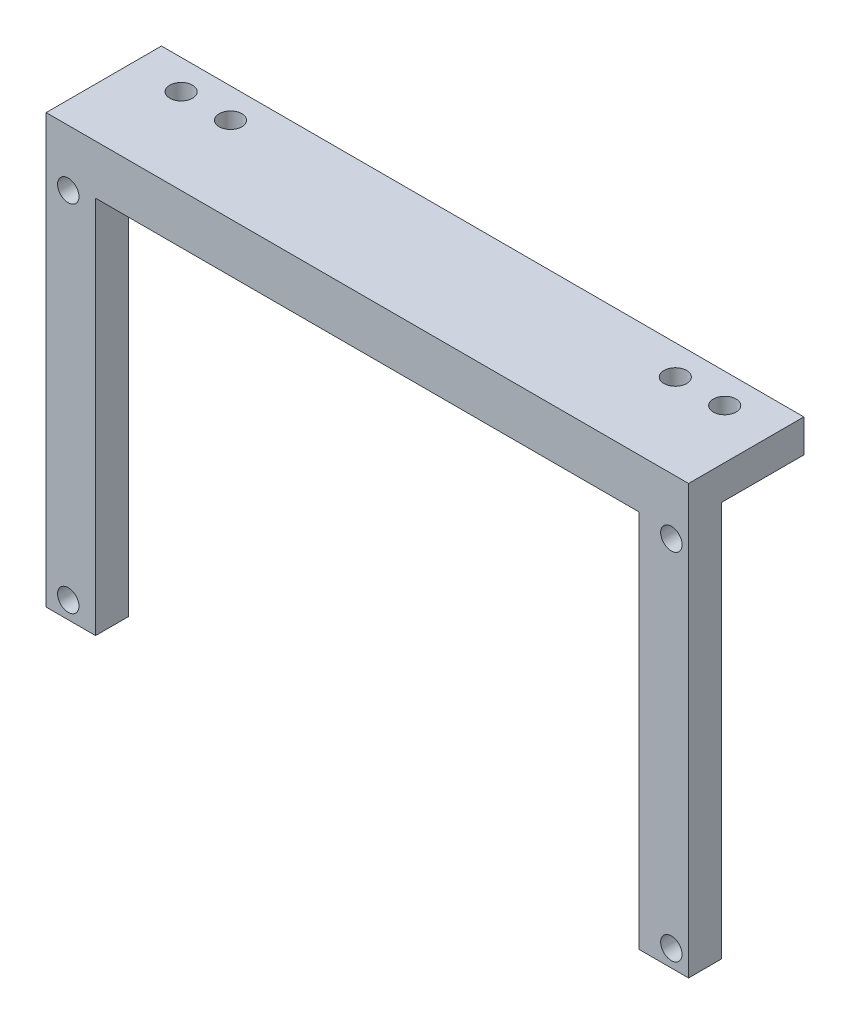
ISO-10303-21;
HEADER;
FILE_DESCRIPTION(('STEP AP214'),'2;1');
FILE_NAME('part.step','',(''),(''),'','','');
FILE_SCHEMA(('AUTOMOTIVE_DESIGN { 1 0 10303 214 1 1 1 1 }'));
ENDSEC;
DATA;
#1=APPLICATION_CONTEXT('core data for automotive mechanical design processes');
#2=APPLICATION_PROTOCOL_DEFINITION('international standard','automotive_design',2000,#1);
#3=PRODUCT_CONTEXT('',#1,'mechanical');
#4=PRODUCT('Part','Part','',(#3));
#5=PRODUCT_RELATED_PRODUCT_CATEGORY('part','',(#4));
#6=PRODUCT_DEFINITION_FORMATION('','',#4);
#7=PRODUCT_DEFINITION_CONTEXT('part definition',#1,'design');
#8=PRODUCT_DEFINITION('design','',#6,#7);
#9=PRODUCT_DEFINITION_SHAPE('','',#8);
#10=(LENGTH_UNIT() NAMED_UNIT(*) SI_UNIT(.MILLI.,.METRE.));
#11=(NAMED_UNIT(*) PLANE_ANGLE_UNIT() SI_UNIT($,.RADIAN.));
#12=(NAMED_UNIT(*) SI_UNIT($,.STERADIAN.) SOLID_ANGLE_UNIT());
#13=UNCERTAINTY_MEASURE_WITH_UNIT(LENGTH_MEASURE(1.E-05),#10,'distance_accuracy_value','');
#14=(GEOMETRIC_REPRESENTATION_CONTEXT(3) GLOBAL_UNCERTAINTY_ASSIGNED_CONTEXT((#13)) GLOBAL_UNIT_ASSIGNED_CONTEXT((#10,
#11,#12)) REPRESENTATION_CONTEXT('',''));
#15=CARTESIAN_POINT('',(0.,0.,0.));
#16=DIRECTION('',(0.,0.,1.));
#17=DIRECTION('',(1.,0.,0.));
#18=AXIS2_PLACEMENT_3D('',#15,#16,#17);
#19=CARTESIAN_POINT('',(99.06,-39.8584615384615,29.8974035768154));
#20=DIRECTION('',(0.,0.,-1.));
#21=DIRECTION('',(-1.,0.,0.));
#22=AXIS2_PLACEMENT_3D('',#19,#20,#21);
#23=PLANE('',#22);
#24=CARTESIAN_POINT('',(3.40999999999998,-37.2084615384616,29.8974035768154));
#25=DIRECTION('',(0.,0.,-1.));
#26=DIRECTION('',(-1.,0.,0.));
#27=AXIS2_PLACEMENT_3D('',#24,#25,#26);
#28=CIRCLE('',#27,1.65000000000001);
#29=CARTESIAN_POINT('',(1.75999999999997,-37.2084615384616,29.8974035768154));
#30=VERTEX_POINT('',#29);
#31=EDGE_CURVE('E174',#30,#30,#28,.F.);
#32=ORIENTED_EDGE('',*,*,#31,.F.);
#33=EDGE_LOOP('',(#32));
#34=FACE_BOUND('',#33,.T.);
#35=CARTESIAN_POINT('',(3.40999999999998,17.4915384615384,29.8974035768154));
#36=DIRECTION('',(0.,0.,-1.));
#37=DIRECTION('',(-1.,0.,0.));
#38=AXIS2_PLACEMENT_3D('',#35,#36,#37);
#39=CIRCLE('',#38,1.65);
#40=CARTESIAN_POINT('',(1.75999999999997,17.4915384615384,29.8974035768154));
#41=VERTEX_POINT('',#40);
#42=EDGE_CURVE('E170',#41,#41,#39,.F.);
#43=ORIENTED_EDGE('',*,*,#42,.F.);
#44=EDGE_LOOP('',(#43));
#45=FACE_BOUND('',#44,.T.);
#46=CARTESIAN_POINT('',(96.41,17.4915384615384,29.8974035768154));
#47=DIRECTION('',(0.,0.,-1.));
#48=DIRECTION('',(-1.,0.,0.));
#49=AXIS2_PLACEMENT_3D('',#46,#47,#48);
#50=CIRCLE('',#49,1.65);
#51=CARTESIAN_POINT('',(94.76,17.4915384615384,29.8974035768154));
#52=VERTEX_POINT('',#51);
#53=EDGE_CURVE('E166',#52,#52,#50,.F.);
#54=ORIENTED_EDGE('',*,*,#53,.F.);
#55=EDGE_LOOP('',(#54));
#56=FACE_BOUND('',#55,.T.);
#57=CARTESIAN_POINT('',(96.41,-37.2084615384616,29.8974035768154));
#58=DIRECTION('',(0.,0.,-1.));
#59=DIRECTION('',(-1.,0.,0.));
#60=AXIS2_PLACEMENT_3D('',#57,#58,#59);
#61=CIRCLE('',#60,1.65);
#62=CARTESIAN_POINT('',(94.76,-37.2084615384616,29.8974035768154));
#63=VERTEX_POINT('',#62);
#64=EDGE_CURVE('E161',#63,#63,#61,.F.);
#65=ORIENTED_EDGE('',*,*,#64,.F.);
#66=EDGE_LOOP('',(#65));
#67=FACE_BOUND('',#66,.T.);
#68=DIRECTION('',(0.,1.,0.));
#69=VECTOR('',#68,1.);
#70=CARTESIAN_POINT('',(91.44,-39.8584615384615,29.8974035768154));
#71=LINE('',#70,#69);
#72=CARTESIAN_POINT('',(91.44,-39.8584615384615,29.8974035768154));
#73=VERTEX_POINT('',#72);
#74=CARTESIAN_POINT('',(91.44,18.5615384615385,29.8974035768153));
#75=VERTEX_POINT('',#74);
#76=EDGE_CURVE('E134',#73,#75,#71,.T.);
#77=ORIENTED_EDGE('',*,*,#76,.F.);
#78=DIRECTION('',(-1.,0.,0.));
#79=VECTOR('',#78,1.);
#80=CARTESIAN_POINT('',(99.06,-39.8584615384615,29.8974035768154));
#81=LINE('',#80,#79);
#82=CARTESIAN_POINT('',(99.06,-39.8584615384615,29.8974035768154));
#83=VERTEX_POINT('',#82);
#84=EDGE_CURVE('E152',#83,#73,#81,.T.);
#85=ORIENTED_EDGE('',*,*,#84,.F.);
#86=DIRECTION('',(0.,-1.,0.));
#87=VECTOR('',#86,1.);
#88=CARTESIAN_POINT('',(99.06,-39.8584615384615,29.8974035768154));
#89=LINE('',#88,#87);
#90=CARTESIAN_POINT('',(99.06,26.1815384615385,29.8974035768154));
#91=VERTEX_POINT('',#90);
#92=EDGE_CURVE('E143',#91,#83,#89,.T.);
#93=ORIENTED_EDGE('',*,*,#92,.F.);
#94=DIRECTION('',(-1.,0.,0.));
#95=VECTOR('',#94,1.);
#96=CARTESIAN_POINT('',(99.06,26.1815384615385,29.8974035768154));
#97=LINE('',#96,#95);
#98=CARTESIAN_POINT('',(0.,26.1815384615385,29.8974035768154));
#99=VERTEX_POINT('',#98);
#100=EDGE_CURVE('E126',#91,#99,#97,.T.);
#101=ORIENTED_EDGE('',*,*,#100,.T.);
#102=DIRECTION('',(0.,-1.,0.));
#103=VECTOR('',#102,1.);
#104=CARTESIAN_POINT('',(0.,-39.8584615384615,29.8974035768154));
#105=LINE('',#104,#103);
#106=CARTESIAN_POINT('',(0.,-39.8584615384615,29.8974035768154));
#107=VERTEX_POINT('',#106);
#108=EDGE_CURVE('E130',#99,#107,#105,.T.);
#109=ORIENTED_EDGE('',*,*,#108,.T.);
#110=CARTESIAN_POINT('',(7.62000000000002,-39.8584615384615,29.8974035768154));
#111=VERTEX_POINT('',#110);
#112=EDGE_CURVE('E151',#111,#107,#81,.T.);
#113=ORIENTED_EDGE('',*,*,#112,.F.);
#114=DIRECTION('',(0.,-1.,0.));
#115=VECTOR('',#114,1.);
#116=CARTESIAN_POINT('',(7.62000000000002,-39.8584615384616,29.8974035768154));
#117=LINE('',#116,#115);
#118=CARTESIAN_POINT('',(7.62,18.5615384615385,29.8974035768153));
#119=VERTEX_POINT('',#118);
#120=EDGE_CURVE('E212',#119,#111,#117,.T.);
#121=ORIENTED_EDGE('',*,*,#120,.F.);
#122=DIRECTION('',(-1.,0.,0.));
#123=VECTOR('',#122,1.);
#124=CARTESIAN_POINT('',(99.06,18.5615384615385,29.8974035768154));
#125=LINE('',#124,#123);
#126=EDGE_CURVE('E214',#75,#119,#125,.T.);
#127=ORIENTED_EDGE('',*,*,#126,.F.);
#128=EDGE_LOOP('',(#77,#85,#93,#101,#109,#113,#121,#127));
#129=FACE_BOUND('',#128,.T.);
#130=ADVANCED_FACE('F32',(#34,#45,#56,#67,#129),#23,.F.);
#131=CARTESIAN_POINT('',(99.06,-39.8584615384615,29.8974035768154));
#132=DIRECTION('',(0.,1.,0.));
#133=DIRECTION('',(0.,0.,1.));
#134=AXIS2_PLACEMENT_3D('',#131,#132,#133);
#135=PLANE('',#134);
#136=DIRECTION('',(0.,0.,1.));
#137=VECTOR('',#136,1.);
#138=CARTESIAN_POINT('',(91.44,-39.8584615384615,29.8974035768154));
#139=LINE('',#138,#137);
#140=CARTESIAN_POINT('',(91.44,-39.8584615384615,24.8174035768154));
#141=VERTEX_POINT('',#140);
#142=EDGE_CURVE('E217',#141,#73,#139,.T.);
#143=ORIENTED_EDGE('',*,*,#142,.F.);
#144=DIRECTION('',(-1.,0.,0.));
#145=VECTOR('',#144,1.);
#146=CARTESIAN_POINT('',(99.06,-39.8584615384615,24.8174035768154));
#147=LINE('',#146,#145);
#148=CARTESIAN_POINT('',(99.06,-39.8584615384615,24.8174035768154));
#149=VERTEX_POINT('',#148);
#150=EDGE_CURVE('E148',#149,#141,#147,.T.);
#151=ORIENTED_EDGE('',*,*,#150,.F.);
#152=DIRECTION('',(0.,0.,-1.));
#153=VECTOR('',#152,1.);
#154=CARTESIAN_POINT('',(99.06,-39.8584615384615,29.8974035768154));
#155=LINE('',#154,#153);
#156=EDGE_CURVE('E93',#83,#149,#155,.T.);
#157=ORIENTED_EDGE('',*,*,#156,.F.);
#158=ORIENTED_EDGE('',*,*,#84,.T.);
#159=EDGE_LOOP('',(#143,#151,#157,#158));
#160=FACE_BOUND('',#159,.T.);
#161=ADVANCED_FACE('F226',(#160),#135,.F.);
#162=DIRECTION('',(0.,0.,-1.));
#163=VECTOR('',#162,1.);
#164=CARTESIAN_POINT('',(7.62000000000002,-39.8584615384615,29.8974035768154));
#165=LINE('',#164,#163);
#166=CARTESIAN_POINT('',(7.62,-39.8584615384615,24.8174035768154));
#167=VERTEX_POINT('',#166);
#168=EDGE_CURVE('E48',#111,#167,#165,.T.);
#169=ORIENTED_EDGE('',*,*,#168,.F.);
#170=ORIENTED_EDGE('',*,*,#112,.T.);
#171=DIRECTION('',(0.,0.,-1.));
#172=VECTOR('',#171,1.);
#173=CARTESIAN_POINT('',(0.,-39.8584615384615,29.8974035768154));
#174=LINE('',#173,#172);
#175=CARTESIAN_POINT('',(0.,-39.8584615384615,24.8174035768154));
#176=VERTEX_POINT('',#175);
#177=EDGE_CURVE('E133',#107,#176,#174,.T.);
#178=ORIENTED_EDGE('',*,*,#177,.T.);
#179=EDGE_CURVE('E147',#167,#176,#147,.T.);
#180=ORIENTED_EDGE('',*,*,#179,.F.);
#181=EDGE_LOOP('',(#169,#170,#178,#180));
#182=FACE_BOUND('',#181,.T.);
#183=ADVANCED_FACE('F260',(#182),#135,.F.);
#184=CARTESIAN_POINT('',(99.06,-39.8584615384615,24.8174035768154));
#185=DIRECTION('',(0.,0.,1.));
#186=DIRECTION('',(1.,0.,0.));
#187=AXIS2_PLACEMENT_3D('',#184,#185,#186);
#188=PLANE('',#187);
#189=CARTESIAN_POINT('',(3.40999999999998,-37.2084615384616,24.8174035768154));
#190=DIRECTION('',(0.,0.,1.));
#191=DIRECTION('',(1.,0.,0.));
#192=AXIS2_PLACEMENT_3D('',#189,#190,#191);
#193=CIRCLE('',#192,1.65000000000001);
#194=CARTESIAN_POINT('',(5.05999999999998,-37.2084615384616,24.8174035768154));
#195=VERTEX_POINT('',#194);
#196=EDGE_CURVE('E171',#195,#195,#193,.F.);
#197=ORIENTED_EDGE('',*,*,#196,.F.);
#198=EDGE_LOOP('',(#197));
#199=FACE_BOUND('',#198,.T.);
#200=CARTESIAN_POINT('',(3.40999999999998,17.4915384615384,24.8174035768154));
#201=DIRECTION('',(0.,0.,1.));
#202=DIRECTION('',(1.,0.,0.));
#203=AXIS2_PLACEMENT_3D('',#200,#201,#202);
#204=CIRCLE('',#203,1.65);
#205=CARTESIAN_POINT('',(5.05999999999998,17.4915384615384,24.8174035768154));
#206=VERTEX_POINT('',#205);
#207=EDGE_CURVE('E167',#206,#206,#204,.F.);
#208=ORIENTED_EDGE('',*,*,#207,.F.);
#209=EDGE_LOOP('',(#208));
#210=FACE_BOUND('',#209,.T.);
#211=CARTESIAN_POINT('',(96.41,17.4915384615384,24.8174035768154));
#212=DIRECTION('',(0.,0.,1.));
#213=DIRECTION('',(1.,0.,0.));
#214=AXIS2_PLACEMENT_3D('',#211,#212,#213);
#215=CIRCLE('',#214,1.65);
#216=CARTESIAN_POINT('',(98.06,17.4915384615384,24.8174035768154));
#217=VERTEX_POINT('',#216);
#218=EDGE_CURVE('E163',#217,#217,#215,.F.);
#219=ORIENTED_EDGE('',*,*,#218,.F.);
#220=EDGE_LOOP('',(#219));
#221=FACE_BOUND('',#220,.T.);
#222=CARTESIAN_POINT('',(96.41,-37.2084615384616,24.8174035768154));
#223=DIRECTION('',(0.,0.,1.));
#224=DIRECTION('',(1.,0.,0.));
#225=AXIS2_PLACEMENT_3D('',#222,#223,#224);
#226=CIRCLE('',#225,1.65);
#227=CARTESIAN_POINT('',(98.06,-37.2084615384616,24.8174035768154));
#228=VERTEX_POINT('',#227);
#229=EDGE_CURVE('E158',#228,#228,#226,.F.);
#230=ORIENTED_EDGE('',*,*,#229,.F.);
#231=EDGE_LOOP('',(#230));
#232=FACE_BOUND('',#231,.T.);
#233=DIRECTION('',(0.,-1.,0.));
#234=VECTOR('',#233,1.);
#235=CARTESIAN_POINT('',(91.44,-39.8584615384615,24.8174035768154));
#236=LINE('',#235,#234);
#237=CARTESIAN_POINT('',(91.44,18.5615384615385,24.8174035768153));
#238=VERTEX_POINT('',#237);
#239=EDGE_CURVE('E11',#238,#141,#236,.T.);
#240=ORIENTED_EDGE('',*,*,#239,.F.);
#241=DIRECTION('',(1.,0.,0.));
#242=VECTOR('',#241,1.);
#243=CARTESIAN_POINT('',(99.06,18.5615384615385,24.8174035768154));
#244=LINE('',#243,#242);
#245=CARTESIAN_POINT('',(7.62,18.5615384615385,24.8174035768153));
#246=VERTEX_POINT('',#245);
#247=EDGE_CURVE('E40',#246,#238,#244,.T.);
#248=ORIENTED_EDGE('',*,*,#247,.F.);
#249=DIRECTION('',(0.,1.,0.));
#250=VECTOR('',#249,1.);
#251=CARTESIAN_POINT('',(7.62000000000002,-39.8584615384616,24.8174035768154));
#252=LINE('',#251,#250);
#253=EDGE_CURVE('E154',#167,#246,#252,.T.);
#254=ORIENTED_EDGE('',*,*,#253,.F.);
#255=ORIENTED_EDGE('',*,*,#179,.T.);
#256=DIRECTION('',(0.,1.,0.));
#257=VECTOR('',#256,1.);
#258=CARTESIAN_POINT('',(0.,-39.8584615384615,24.8174035768154));
#259=LINE('',#258,#257);
#260=CARTESIAN_POINT('',(0.,21.1015384615385,24.8174035768154));
#261=VERTEX_POINT('',#260);
#262=EDGE_CURVE('E137',#176,#261,#259,.T.);
#263=ORIENTED_EDGE('',*,*,#262,.T.);
#264=DIRECTION('',(-1.,0.,0.));
#265=VECTOR('',#264,1.);
#266=CARTESIAN_POINT('',(99.06,21.1015384615385,24.8174035768154));
#267=LINE('',#266,#265);
#268=CARTESIAN_POINT('',(99.06,21.1015384615385,24.8174035768154));
#269=VERTEX_POINT('',#268);
#270=EDGE_CURVE('E121',#269,#261,#267,.T.);
#271=ORIENTED_EDGE('',*,*,#270,.F.);
#272=DIRECTION('',(0.,1.,0.));
#273=VECTOR('',#272,1.);
#274=CARTESIAN_POINT('',(99.06,-39.8584615384615,24.8174035768154));
#275=LINE('',#274,#273);
#276=EDGE_CURVE('E109',#149,#269,#275,.T.);
#277=ORIENTED_EDGE('',*,*,#276,.F.);
#278=ORIENTED_EDGE('',*,*,#150,.T.);
#279=EDGE_LOOP('',(#240,#248,#254,#255,#263,#271,#277,#278));
#280=FACE_BOUND('',#279,.T.);
#281=ADVANCED_FACE('F230',(#199,#210,#221,#232,#280),#188,.F.);
#282=CARTESIAN_POINT('',(99.06,21.1015384615385,24.8174035768154));
#283=DIRECTION('',(0.,1.,0.));
#284=DIRECTION('',(0.,0.,1.));
#285=AXIS2_PLACEMENT_3D('',#282,#283,#284);
#286=PLANE('',#285);
#287=CARTESIAN_POINT('',(7.62,21.1015384615384,16.7021504300272));
#288=DIRECTION('',(0.,1.,0.));
#289=DIRECTION('',(0.,0.,1.));
#290=AXIS2_PLACEMENT_3D('',#287,#288,#289);
#291=CIRCLE('',#290,1.7526);
#292=CARTESIAN_POINT('',(7.62,21.1015384615384,18.4547504300272));
#293=VERTEX_POINT('',#292);
#294=EDGE_CURVE('E162',#293,#293,#291,.F.);
#295=ORIENTED_EDGE('',*,*,#294,.F.);
#296=EDGE_LOOP('',(#295));
#297=FACE_BOUND('',#296,.T.);
#298=CARTESIAN_POINT('',(15.24,21.1015384615384,16.7021504300272));
#299=DIRECTION('',(0.,1.,0.));
#300=DIRECTION('',(0.,0.,1.));
#301=AXIS2_PLACEMENT_3D('',#298,#299,#300);
#302=CIRCLE('',#301,1.7526);
#303=CARTESIAN_POINT('',(15.24,21.1015384615384,18.4547504300272));
#304=VERTEX_POINT('',#303);
#305=EDGE_CURVE('E184',#304,#304,#302,.F.);
#306=ORIENTED_EDGE('',*,*,#305,.F.);
#307=EDGE_LOOP('',(#306));
#308=FACE_BOUND('',#307,.T.);
#309=CARTESIAN_POINT('',(83.82,21.1015384615384,16.7021504300272));
#310=DIRECTION('',(0.,1.,0.));
#311=DIRECTION('',(0.,0.,1.));
#312=AXIS2_PLACEMENT_3D('',#309,#310,#311);
#313=CIRCLE('',#312,1.7526);
#314=CARTESIAN_POINT('',(83.82,21.1015384615384,18.4547504300272));
#315=VERTEX_POINT('',#314);
#316=EDGE_CURVE('E181',#315,#315,#313,.F.);
#317=ORIENTED_EDGE('',*,*,#316,.F.);
#318=EDGE_LOOP('',(#317));
#319=FACE_BOUND('',#318,.T.);
#320=CARTESIAN_POINT('',(91.44,21.1015384615384,16.7021504300272));
#321=DIRECTION('',(0.,1.,0.));
#322=DIRECTION('',(0.,0.,1.));
#323=AXIS2_PLACEMENT_3D('',#320,#321,#322);
#324=CIRCLE('',#323,1.75259999999999);
#325=CARTESIAN_POINT('',(91.44,21.1015384615384,18.4547504300272));
#326=VERTEX_POINT('',#325);
#327=EDGE_CURVE('E178',#326,#326,#324,.F.);
#328=ORIENTED_EDGE('',*,*,#327,.F.);
#329=EDGE_LOOP('',(#328));
#330=FACE_BOUND('',#329,.T.);
#331=DIRECTION('',(0.,0.,-1.));
#332=VECTOR('',#331,1.);
#333=CARTESIAN_POINT('',(0.,21.1015384615385,24.8174035768154));
#334=LINE('',#333,#332);
#335=CARTESIAN_POINT('',(0.,21.1015384615385,12.1174035768153));
#336=VERTEX_POINT('',#335);
#337=EDGE_CURVE('E118',#261,#336,#334,.T.);
#338=ORIENTED_EDGE('',*,*,#337,.T.);
#339=DIRECTION('',(-1.,0.,0.));
#340=VECTOR('',#339,1.);
#341=CARTESIAN_POINT('',(99.06,21.1015384615385,12.1174035768153));
#342=LINE('',#341,#340);
#343=CARTESIAN_POINT('',(99.06,21.1015384615385,12.1174035768153));
#344=VERTEX_POINT('',#343);
#345=EDGE_CURVE('E115',#344,#336,#342,.T.);
#346=ORIENTED_EDGE('',*,*,#345,.F.);
#347=DIRECTION('',(0.,0.,-1.));
#348=VECTOR('',#347,1.);
#349=CARTESIAN_POINT('',(99.06,21.1015384615385,24.8174035768154));
#350=LINE('',#349,#348);
#351=EDGE_CURVE('E102',#269,#344,#350,.T.);
#352=ORIENTED_EDGE('',*,*,#351,.F.);
#353=ORIENTED_EDGE('',*,*,#270,.T.);
#354=EDGE_LOOP('',(#338,#346,#352,#353));
#355=FACE_BOUND('',#354,.T.);
#356=ADVANCED_FACE('F116',(#297,#308,#319,#330,#355),#286,.F.);
#357=CARTESIAN_POINT('',(99.06,26.1815384615385,12.1174035768154));
#358=DIRECTION('',(0.,0.,1.));
#359=DIRECTION('',(0.,-1.,0.));
#360=AXIS2_PLACEMENT_3D('',#357,#358,#359);
#361=PLANE('',#360);
#362=DIRECTION('',(0.,1.,0.));
#363=VECTOR('',#362,1.);
#364=CARTESIAN_POINT('',(0.,26.1815384615385,12.1174035768154));
#365=LINE('',#364,#363);
#366=CARTESIAN_POINT('',(0.,26.1815384615385,12.1174035768154));
#367=VERTEX_POINT('',#366);
#368=EDGE_CURVE('E140',#336,#367,#365,.T.);
#369=ORIENTED_EDGE('',*,*,#368,.T.);
#370=DIRECTION('',(-1.,0.,0.));
#371=VECTOR('',#370,1.);
#372=CARTESIAN_POINT('',(99.06,26.1815384615385,12.1174035768154));
#373=LINE('',#372,#371);
#374=CARTESIAN_POINT('',(99.06,26.1815384615385,12.1174035768154));
#375=VERTEX_POINT('',#374);
#376=EDGE_CURVE('E122',#375,#367,#373,.T.);
#377=ORIENTED_EDGE('',*,*,#376,.F.);
#378=DIRECTION('',(0.,1.,0.));
#379=VECTOR('',#378,1.);
#380=CARTESIAN_POINT('',(99.06,26.1815384615385,12.1174035768154));
#381=LINE('',#380,#379);
#382=EDGE_CURVE('E106',#344,#375,#381,.T.);
#383=ORIENTED_EDGE('',*,*,#382,.F.);
#384=ORIENTED_EDGE('',*,*,#345,.T.);
#385=EDGE_LOOP('',(#369,#377,#383,#384));
#386=FACE_BOUND('',#385,.T.);
#387=ADVANCED_FACE('F124',(#386),#361,.F.);
#388=CARTESIAN_POINT('',(99.06,26.1815384615385,29.8974035768154));
#389=DIRECTION('',(0.,-1.,0.));
#390=DIRECTION('',(0.,0.,-1.));
#391=AXIS2_PLACEMENT_3D('',#388,#389,#390);
#392=PLANE('',#391);
#393=CARTESIAN_POINT('',(7.62,26.1815384615385,16.7021504300272));
#394=DIRECTION('',(0.,-1.,0.));
#395=DIRECTION('',(0.,0.,-1.));
#396=AXIS2_PLACEMENT_3D('',#393,#394,#395);
#397=CIRCLE('',#396,1.7526);
#398=CARTESIAN_POINT('',(7.62,26.1815384615385,14.9495504300272));
#399=VERTEX_POINT('',#398);
#400=EDGE_CURVE('E35',#399,#399,#397,.F.);
#401=ORIENTED_EDGE('',*,*,#400,.F.);
#402=EDGE_LOOP('',(#401));
#403=FACE_BOUND('',#402,.T.);
#404=CARTESIAN_POINT('',(15.24,26.1815384615385,16.7021504300272));
#405=DIRECTION('',(0.,-1.,0.));
#406=DIRECTION('',(0.,0.,-1.));
#407=AXIS2_PLACEMENT_3D('',#404,#405,#406);
#408=CIRCLE('',#407,1.7526);
#409=CARTESIAN_POINT('',(15.24,26.1815384615385,14.9495504300272));
#410=VERTEX_POINT('',#409);
#411=EDGE_CURVE('E182',#410,#410,#408,.F.);
#412=ORIENTED_EDGE('',*,*,#411,.F.);
#413=EDGE_LOOP('',(#412));
#414=FACE_BOUND('',#413,.T.);
#415=CARTESIAN_POINT('',(83.82,26.1815384615385,16.7021504300272));
#416=DIRECTION('',(0.,-1.,0.));
#417=DIRECTION('',(0.,0.,-1.));
#418=AXIS2_PLACEMENT_3D('',#415,#416,#417);
#419=CIRCLE('',#418,1.7526);
#420=CARTESIAN_POINT('',(83.82,26.1815384615385,14.9495504300272));
#421=VERTEX_POINT('',#420);
#422=EDGE_CURVE('E179',#421,#421,#419,.F.);
#423=ORIENTED_EDGE('',*,*,#422,.F.);
#424=EDGE_LOOP('',(#423));
#425=FACE_BOUND('',#424,.T.);
#426=CARTESIAN_POINT('',(91.44,26.1815384615385,16.7021504300272));
#427=DIRECTION('',(0.,-1.,0.));
#428=DIRECTION('',(0.,0.,-1.));
#429=AXIS2_PLACEMENT_3D('',#426,#427,#428);
#430=CIRCLE('',#429,1.75259999999999);
#431=CARTESIAN_POINT('',(91.44,26.1815384615385,14.9495504300272));
#432=VERTEX_POINT('',#431);
#433=EDGE_CURVE('E175',#432,#432,#430,.F.);
#434=ORIENTED_EDGE('',*,*,#433,.F.);
#435=EDGE_LOOP('',(#434));
#436=FACE_BOUND('',#435,.T.);
#437=DIRECTION('',(0.,0.,1.));
#438=VECTOR('',#437,1.);
#439=CARTESIAN_POINT('',(0.,26.1815384615385,29.8974035768154));
#440=LINE('',#439,#438);
#441=EDGE_CURVE('E84',#367,#99,#440,.T.);
#442=ORIENTED_EDGE('',*,*,#441,.T.);
#443=ORIENTED_EDGE('',*,*,#100,.F.);
#444=DIRECTION('',(0.,0.,1.));
#445=VECTOR('',#444,1.);
#446=CARTESIAN_POINT('',(99.06,26.1815384615385,29.8974035768154));
#447=LINE('',#446,#445);
#448=EDGE_CURVE('E57',#375,#91,#447,.T.);
#449=ORIENTED_EDGE('',*,*,#448,.F.);
#450=ORIENTED_EDGE('',*,*,#376,.T.);
#451=EDGE_LOOP('',(#442,#443,#449,#450));
#452=FACE_BOUND('',#451,.T.);
#453=ADVANCED_FACE('F236',(#403,#414,#425,#436,#452),#392,.F.);
#454=CARTESIAN_POINT('',(99.06,0.,0.));
#455=DIRECTION('',(-1.,0.,0.));
#456=DIRECTION('',(0.,0.,1.));
#457=AXIS2_PLACEMENT_3D('',#454,#455,#456);
#458=PLANE('',#457);
#459=ORIENTED_EDGE('',*,*,#92,.T.);
#460=ORIENTED_EDGE('',*,*,#156,.T.);
#461=ORIENTED_EDGE('',*,*,#276,.T.);
#462=ORIENTED_EDGE('',*,*,#351,.T.);
#463=ORIENTED_EDGE('',*,*,#382,.T.);
#464=ORIENTED_EDGE('',*,*,#448,.T.);
#465=EDGE_LOOP('',(#459,#460,#461,#462,#463,#464));
#466=FACE_BOUND('',#465,.T.);
#467=ADVANCED_FACE('F104',(#466),#458,.F.);
#468=CARTESIAN_POINT('',(0.,0.,0.));
#469=DIRECTION('',(-1.,0.,0.));
#470=DIRECTION('',(0.,0.,1.));
#471=AXIS2_PLACEMENT_3D('',#468,#469,#470);
#472=PLANE('',#471);
#473=ORIENTED_EDGE('',*,*,#108,.F.);
#474=ORIENTED_EDGE('',*,*,#441,.F.);
#475=ORIENTED_EDGE('',*,*,#368,.F.);
#476=ORIENTED_EDGE('',*,*,#337,.F.);
#477=ORIENTED_EDGE('',*,*,#262,.F.);
#478=ORIENTED_EDGE('',*,*,#177,.F.);
#479=EDGE_LOOP('',(#473,#474,#475,#476,#477,#478));
#480=FACE_BOUND('',#479,.T.);
#481=ADVANCED_FACE('F234',(#480),#472,.T.);
#482=CARTESIAN_POINT('',(91.44,-42.3984615384615,86.106));
#483=DIRECTION('',(-1.,0.,0.));
#484=DIRECTION('',(0.,0.,1.));
#485=AXIS2_PLACEMENT_3D('',#482,#483,#484);
#486=PLANE('',#485);
#487=ORIENTED_EDGE('',*,*,#76,.T.);
#488=DIRECTION('',(0.,0.,-1.));
#489=VECTOR('',#488,1.);
#490=CARTESIAN_POINT('',(91.44,18.5615384615385,86.106));
#491=LINE('',#490,#489);
#492=EDGE_CURVE('E208',#75,#238,#491,.T.);
#493=ORIENTED_EDGE('',*,*,#492,.T.);
#494=ORIENTED_EDGE('',*,*,#239,.T.);
#495=ORIENTED_EDGE('',*,*,#142,.T.);
#496=EDGE_LOOP('',(#487,#493,#494,#495));
#497=FACE_BOUND('',#496,.T.);
#498=ADVANCED_FACE('F262',(#497),#486,.T.);
#499=CARTESIAN_POINT('',(7.62,18.5615384615385,86.106));
#500=DIRECTION('',(0.,-1.,0.));
#501=DIRECTION('',(0.,0.,-1.));
#502=AXIS2_PLACEMENT_3D('',#499,#500,#501);
#503=PLANE('',#502);
#504=ORIENTED_EDGE('',*,*,#126,.T.);
#505=DIRECTION('',(0.,0.,-1.));
#506=VECTOR('',#505,1.);
#507=CARTESIAN_POINT('',(7.62,18.5615384615385,86.106));
#508=LINE('',#507,#506);
#509=EDGE_CURVE('E205',#119,#246,#508,.T.);
#510=ORIENTED_EDGE('',*,*,#509,.T.);
#511=ORIENTED_EDGE('',*,*,#247,.T.);
#512=ORIENTED_EDGE('',*,*,#492,.F.);
#513=EDGE_LOOP('',(#504,#510,#511,#512));
#514=FACE_BOUND('',#513,.T.);
#515=ADVANCED_FACE('F254',(#514),#503,.T.);
#516=CARTESIAN_POINT('',(7.62,18.5615384615385,86.106));
#517=DIRECTION('',(1.,0.,0.));
#518=DIRECTION('',(0.,1.,0.));
#519=AXIS2_PLACEMENT_3D('',#516,#517,#518);
#520=PLANE('',#519);
#521=ORIENTED_EDGE('',*,*,#120,.T.);
#522=ORIENTED_EDGE('',*,*,#168,.T.);
#523=ORIENTED_EDGE('',*,*,#253,.T.);
#524=ORIENTED_EDGE('',*,*,#509,.F.);
#525=EDGE_LOOP('',(#521,#522,#523,#524));
#526=FACE_BOUND('',#525,.T.);
#527=ADVANCED_FACE('F257',(#526),#520,.T.);
#528=CARTESIAN_POINT('',(96.41,-37.2084615384616,228.6));
#529=DIRECTION('',(0.,0.,-1.));
#530=DIRECTION('',(-1.,0.,0.));
#531=AXIS2_PLACEMENT_3D('',#528,#529,#530);
#532=CYLINDRICAL_SURFACE('',#531,1.65);
#533=ORIENTED_EDGE('',*,*,#229,.T.);
#534=EDGE_LOOP('',(#533));
#535=FACE_BOUND('',#534,.T.);
#536=ORIENTED_EDGE('',*,*,#64,.T.);
#537=EDGE_LOOP('',(#536));
#538=FACE_BOUND('',#537,.T.);
#539=ADVANCED_FACE('F285',(#535,#538),#532,.F.);
#540=CARTESIAN_POINT('',(96.41,17.4915384615384,228.6));
#541=DIRECTION('',(0.,0.,-1.));
#542=DIRECTION('',(-1.,0.,0.));
#543=AXIS2_PLACEMENT_3D('',#540,#541,#542);
#544=CYLINDRICAL_SURFACE('',#543,1.65);
#545=ORIENTED_EDGE('',*,*,#218,.T.);
#546=EDGE_LOOP('',(#545));
#547=FACE_BOUND('',#546,.T.);
#548=ORIENTED_EDGE('',*,*,#53,.T.);
#549=EDGE_LOOP('',(#548));
#550=FACE_BOUND('',#549,.T.);
#551=ADVANCED_FACE('F287',(#547,#550),#544,.F.);
#552=CARTESIAN_POINT('',(3.40999999999998,17.4915384615384,228.6));
#553=DIRECTION('',(0.,0.,-1.));
#554=DIRECTION('',(-1.,0.,0.));
#555=AXIS2_PLACEMENT_3D('',#552,#553,#554);
#556=CYLINDRICAL_SURFACE('',#555,1.65);
#557=ORIENTED_EDGE('',*,*,#207,.T.);
#558=EDGE_LOOP('',(#557));
#559=FACE_BOUND('',#558,.T.);
#560=ORIENTED_EDGE('',*,*,#42,.T.);
#561=EDGE_LOOP('',(#560));
#562=FACE_BOUND('',#561,.T.);
#563=ADVANCED_FACE('F294',(#559,#562),#556,.F.);
#564=CARTESIAN_POINT('',(3.40999999999998,-37.2084615384616,228.6));
#565=DIRECTION('',(0.,0.,-1.));
#566=DIRECTION('',(-1.,0.,0.));
#567=AXIS2_PLACEMENT_3D('',#564,#565,#566);
#568=CYLINDRICAL_SURFACE('',#567,1.65000000000001);
#569=ORIENTED_EDGE('',*,*,#196,.T.);
#570=EDGE_LOOP('',(#569));
#571=FACE_BOUND('',#570,.T.);
#572=ORIENTED_EDGE('',*,*,#31,.T.);
#573=EDGE_LOOP('',(#572));
#574=FACE_BOUND('',#573,.T.);
#575=ADVANCED_FACE('F299',(#571,#574),#568,.F.);
#576=CARTESIAN_POINT('',(91.44,228.6,16.7021504300272));
#577=DIRECTION('',(0.,-1.,0.));
#578=DIRECTION('',(0.,0.,-1.));
#579=AXIS2_PLACEMENT_3D('',#576,#577,#578);
#580=CYLINDRICAL_SURFACE('',#579,1.75259999999999);
#581=ORIENTED_EDGE('',*,*,#433,.T.);
#582=EDGE_LOOP('',(#581));
#583=FACE_BOUND('',#582,.T.);
#584=ORIENTED_EDGE('',*,*,#327,.T.);
#585=EDGE_LOOP('',(#584));
#586=FACE_BOUND('',#585,.T.);
#587=ADVANCED_FACE('F302',(#583,#586),#580,.F.);
#588=CARTESIAN_POINT('',(83.82,228.6,16.7021504300272));
#589=DIRECTION('',(0.,-1.,0.));
#590=DIRECTION('',(0.,0.,-1.));
#591=AXIS2_PLACEMENT_3D('',#588,#589,#590);
#592=CYLINDRICAL_SURFACE('',#591,1.7526);
#593=ORIENTED_EDGE('',*,*,#422,.T.);
#594=EDGE_LOOP('',(#593));
#595=FACE_BOUND('',#594,.T.);
#596=ORIENTED_EDGE('',*,*,#316,.T.);
#597=EDGE_LOOP('',(#596));
#598=FACE_BOUND('',#597,.T.);
#599=ADVANCED_FACE('F309',(#595,#598),#592,.F.);
#600=CARTESIAN_POINT('',(15.24,228.6,16.7021504300272));
#601=DIRECTION('',(0.,-1.,0.));
#602=DIRECTION('',(0.,0.,-1.));
#603=AXIS2_PLACEMENT_3D('',#600,#601,#602);
#604=CYLINDRICAL_SURFACE('',#603,1.7526);
#605=ORIENTED_EDGE('',*,*,#411,.T.);
#606=EDGE_LOOP('',(#605));
#607=FACE_BOUND('',#606,.T.);
#608=ORIENTED_EDGE('',*,*,#305,.T.);
#609=EDGE_LOOP('',(#608));
#610=FACE_BOUND('',#609,.T.);
#611=ADVANCED_FACE('F313',(#607,#610),#604,.F.);
#612=CARTESIAN_POINT('',(7.62,228.6,16.7021504300272));
#613=DIRECTION('',(0.,-1.,0.));
#614=DIRECTION('',(0.,0.,-1.));
#615=AXIS2_PLACEMENT_3D('',#612,#613,#614);
#616=CYLINDRICAL_SURFACE('',#615,1.7526);
#617=ORIENTED_EDGE('',*,*,#400,.T.);
#618=EDGE_LOOP('',(#617));
#619=FACE_BOUND('',#618,.T.);
#620=ORIENTED_EDGE('',*,*,#294,.T.);
#621=EDGE_LOOP('',(#620));
#622=FACE_BOUND('',#621,.T.);
#623=ADVANCED_FACE('F317',(#619,#622),#616,.F.);
#624=CLOSED_SHELL('',(#130,#161,#183,#281,#356,#387,#453,#467,#481,#498,#515,#527,#539,#551,
#563,#575,#587,#599,#611,#623));
#625=MANIFOLD_SOLID_BREP('B2',#624);
#626=ADVANCED_BREP_SHAPE_REPRESENTATION('',(#18,#625),#14);
#627=SHAPE_DEFINITION_REPRESENTATION(#9,#626);
ENDSEC;
END-ISO-10303-21;
